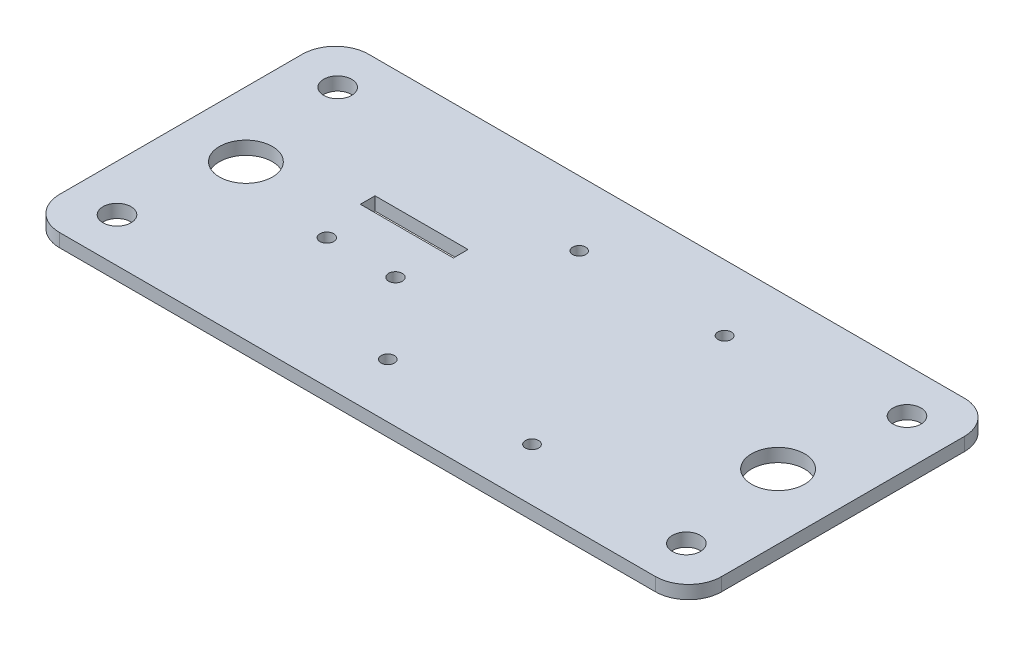
ISO-10303-21;
HEADER;
FILE_DESCRIPTION(('STEP AP214'),'2;1');
FILE_NAME('part.step','',(''),(''),'','','');
FILE_SCHEMA(('AUTOMOTIVE_DESIGN { 1 0 10303 214 1 1 1 1 }'));
ENDSEC;
DATA;
#1=APPLICATION_CONTEXT('core data for automotive mechanical design processes');
#2=APPLICATION_PROTOCOL_DEFINITION('international standard','automotive_design',2000,#1);
#3=PRODUCT_CONTEXT('',#1,'mechanical');
#4=PRODUCT('Part','Part','',(#3));
#5=PRODUCT_RELATED_PRODUCT_CATEGORY('part','',(#4));
#6=PRODUCT_DEFINITION_FORMATION('','',#4);
#7=PRODUCT_DEFINITION_CONTEXT('part definition',#1,'design');
#8=PRODUCT_DEFINITION('design','',#6,#7);
#9=PRODUCT_DEFINITION_SHAPE('','',#8);
#10=(LENGTH_UNIT() NAMED_UNIT(*) SI_UNIT(.MILLI.,.METRE.));
#11=(NAMED_UNIT(*) PLANE_ANGLE_UNIT() SI_UNIT($,.RADIAN.));
#12=(NAMED_UNIT(*) SI_UNIT($,.STERADIAN.) SOLID_ANGLE_UNIT());
#13=UNCERTAINTY_MEASURE_WITH_UNIT(LENGTH_MEASURE(1.E-05),#10,'distance_accuracy_value','');
#14=(GEOMETRIC_REPRESENTATION_CONTEXT(3) GLOBAL_UNCERTAINTY_ASSIGNED_CONTEXT((#13)) GLOBAL_UNIT_ASSIGNED_CONTEXT((#10,
#11,#12)) REPRESENTATION_CONTEXT('',''));
#15=CARTESIAN_POINT('',(0.,0.,0.));
#16=DIRECTION('',(0.,0.,1.));
#17=DIRECTION('',(1.,0.,0.));
#18=AXIS2_PLACEMENT_3D('',#15,#16,#17);
#19=CARTESIAN_POINT('',(0.,3.,0.));
#20=DIRECTION('',(0.,-1.,0.));
#21=DIRECTION('',(0.,0.,-1.));
#22=AXIS2_PLACEMENT_3D('',#19,#20,#21);
#23=PLANE('',#22);
#24=CARTESIAN_POINT('',(135.29252298,3.,-35.));
#25=DIRECTION('',(0.,1.,0.));
#26=DIRECTION('',(0.,0.,1.));
#27=AXIS2_PLACEMENT_3D('',#24,#25,#26);
#28=CIRCLE('',#27,6.00000000000002);
#29=CARTESIAN_POINT('',(135.29252298,3.,-29.));
#30=VERTEX_POINT('',#29);
#31=EDGE_CURVE('E234',#30,#30,#28,.T.);
#32=ORIENTED_EDGE('',*,*,#31,.F.);
#33=EDGE_LOOP('',(#32));
#34=FACE_BOUND('',#33,.T.);
#35=CARTESIAN_POINT('',(14.7074770151367,3.,-35.));
#36=DIRECTION('',(0.,1.,0.));
#37=DIRECTION('',(0.,0.,1.));
#38=AXIS2_PLACEMENT_3D('',#35,#36,#37);
#39=CIRCLE('',#38,6.);
#40=CARTESIAN_POINT('',(14.7074770151367,3.,-29.));
#41=VERTEX_POINT('',#40);
#42=EDGE_CURVE('E223',#41,#41,#39,.T.);
#43=ORIENTED_EDGE('',*,*,#42,.F.);
#44=EDGE_LOOP('',(#43));
#45=FACE_BOUND('',#44,.T.);
#46=CARTESIAN_POINT('',(139.500000000001,3.,-10.));
#47=DIRECTION('',(0.,1.,0.));
#48=DIRECTION('',(0.,0.,1.));
#49=AXIS2_PLACEMENT_3D('',#46,#47,#48);
#50=CIRCLE('',#49,3.175);
#51=CARTESIAN_POINT('',(139.500000000001,3.,-6.825));
#52=VERTEX_POINT('',#51);
#53=EDGE_CURVE('E222',#52,#52,#50,.T.);
#54=ORIENTED_EDGE('',*,*,#53,.F.);
#55=EDGE_LOOP('',(#54));
#56=FACE_BOUND('',#55,.T.);
#57=CARTESIAN_POINT('',(139.5,3.,-60.));
#58=DIRECTION('',(0.,1.,0.));
#59=DIRECTION('',(0.,0.,1.));
#60=AXIS2_PLACEMENT_3D('',#57,#58,#59);
#61=CIRCLE('',#60,3.175);
#62=CARTESIAN_POINT('',(139.5,3.,-56.825));
#63=VERTEX_POINT('',#62);
#64=EDGE_CURVE('E238',#63,#63,#61,.T.);
#65=ORIENTED_EDGE('',*,*,#64,.F.);
#66=EDGE_LOOP('',(#65));
#67=FACE_BOUND('',#66,.T.);
#68=CARTESIAN_POINT('',(10.5000000000007,3.,-10.));
#69=DIRECTION('',(0.,1.,0.));
#70=DIRECTION('',(0.,0.,1.));
#71=AXIS2_PLACEMENT_3D('',#68,#69,#70);
#72=CIRCLE('',#71,3.175);
#73=CARTESIAN_POINT('',(10.5000000000007,3.,-6.825));
#74=VERTEX_POINT('',#73);
#75=EDGE_CURVE('E243',#74,#74,#72,.T.);
#76=ORIENTED_EDGE('',*,*,#75,.F.);
#77=EDGE_LOOP('',(#76));
#78=FACE_BOUND('',#77,.T.);
#79=CARTESIAN_POINT('',(10.5,3.,-60.));
#80=DIRECTION('',(0.,1.,0.));
#81=DIRECTION('',(0.,0.,1.));
#82=AXIS2_PLACEMENT_3D('',#79,#80,#81);
#83=CIRCLE('',#82,3.175);
#84=CARTESIAN_POINT('',(10.5,3.,-56.825));
#85=VERTEX_POINT('',#84);
#86=EDGE_CURVE('E249',#85,#85,#83,.T.);
#87=ORIENTED_EDGE('',*,*,#86,.F.);
#88=EDGE_LOOP('',(#87));
#89=FACE_BOUND('',#88,.T.);
#90=DIRECTION('',(0.,0.,1.));
#91=VECTOR('',#90,1.);
#92=CARTESIAN_POINT('',(0.,3.,0.));
#93=LINE('',#92,#91);
#94=CARTESIAN_POINT('',(0.,3.,-62.5));
#95=VERTEX_POINT('',#94);
#96=CARTESIAN_POINT('',(0.,3.,-7.5));
#97=VERTEX_POINT('',#96);
#98=EDGE_CURVE('E170',#95,#97,#93,.T.);
#99=ORIENTED_EDGE('',*,*,#98,.T.);
#100=CARTESIAN_POINT('',(7.5,3.,-7.5));
#101=DIRECTION('',(0.,-1.,0.));
#102=DIRECTION('',(0.,0.,-1.));
#103=AXIS2_PLACEMENT_3D('',#100,#101,#102);
#104=CIRCLE('',#103,7.5);
#105=CARTESIAN_POINT('',(7.5,3.,0.));
#106=VERTEX_POINT('',#105);
#107=EDGE_CURVE('E213',#97,#106,#104,.F.);
#108=ORIENTED_EDGE('',*,*,#107,.T.);
#109=DIRECTION('',(1.,0.,0.));
#110=VECTOR('',#109,1.);
#111=CARTESIAN_POINT('',(0.,3.,0.));
#112=LINE('',#111,#110);
#113=CARTESIAN_POINT('',(142.5,3.,0.));
#114=VERTEX_POINT('',#113);
#115=EDGE_CURVE('E173',#106,#114,#112,.T.);
#116=ORIENTED_EDGE('',*,*,#115,.T.);
#117=CARTESIAN_POINT('',(142.5,3.,-7.5));
#118=DIRECTION('',(0.,-1.,0.));
#119=DIRECTION('',(0.,0.,-1.));
#120=AXIS2_PLACEMENT_3D('',#117,#118,#119);
#121=CIRCLE('',#120,7.5);
#122=CARTESIAN_POINT('',(150.,3.,-7.5));
#123=VERTEX_POINT('',#122);
#124=EDGE_CURVE('E211',#114,#123,#121,.F.);
#125=ORIENTED_EDGE('',*,*,#124,.T.);
#126=DIRECTION('',(0.,0.,-1.));
#127=VECTOR('',#126,1.);
#128=CARTESIAN_POINT('',(150.,3.,0.));
#129=LINE('',#128,#127);
#130=CARTESIAN_POINT('',(150.,3.,-62.5));
#131=VERTEX_POINT('',#130);
#132=EDGE_CURVE('E177',#123,#131,#129,.T.);
#133=ORIENTED_EDGE('',*,*,#132,.T.);
#134=CARTESIAN_POINT('',(142.5,3.,-62.5));
#135=DIRECTION('',(0.,-1.,0.));
#136=DIRECTION('',(0.,0.,-1.));
#137=AXIS2_PLACEMENT_3D('',#134,#135,#136);
#138=CIRCLE('',#137,7.5);
#139=CARTESIAN_POINT('',(142.5,3.,-70.));
#140=VERTEX_POINT('',#139);
#141=EDGE_CURVE('E56',#131,#140,#138,.F.);
#142=ORIENTED_EDGE('',*,*,#141,.T.);
#143=DIRECTION('',(-1.,0.,0.));
#144=VECTOR('',#143,1.);
#145=CARTESIAN_POINT('',(0.,3.,-70.));
#146=LINE('',#145,#144);
#147=CARTESIAN_POINT('',(7.5,3.,-70.));
#148=VERTEX_POINT('',#147);
#149=EDGE_CURVE('E179',#140,#148,#146,.T.);
#150=ORIENTED_EDGE('',*,*,#149,.T.);
#151=CARTESIAN_POINT('',(7.5,3.,-62.5));
#152=DIRECTION('',(0.,-1.,0.));
#153=DIRECTION('',(0.,0.,-1.));
#154=AXIS2_PLACEMENT_3D('',#151,#152,#153);
#155=CIRCLE('',#154,7.5);
#156=EDGE_CURVE('E208',#148,#95,#155,.F.);
#157=ORIENTED_EDGE('',*,*,#156,.T.);
#158=EDGE_LOOP('',(#99,#108,#116,#125,#133,#142,#150,#157));
#159=FACE_BOUND('',#158,.T.);
#160=DIRECTION('',(0.,0.,1.));
#161=VECTOR('',#160,1.);
#162=CARTESIAN_POINT('',(36.0212361955455,3.,-42.94231273547));
#163=LINE('',#162,#161);
#164=CARTESIAN_POINT('',(36.0212361955455,3.,-42.94231273547));
#165=VERTEX_POINT('',#164);
#166=CARTESIAN_POINT('',(36.0212361955455,3.,-39.6212864919269));
#167=VERTEX_POINT('',#166);
#168=EDGE_CURVE('E126',#165,#167,#163,.T.);
#169=ORIENTED_EDGE('',*,*,#168,.F.);
#170=DIRECTION('',(-1.,0.,0.));
#171=VECTOR('',#170,1.);
#172=CARTESIAN_POINT('',(36.0212361955455,3.,-42.94231273547));
#173=LINE('',#172,#171);
#174=CARTESIAN_POINT('',(57.097585157728,3.,-42.94231273547));
#175=VERTEX_POINT('',#174);
#176=EDGE_CURVE('E152',#175,#165,#173,.T.);
#177=ORIENTED_EDGE('',*,*,#176,.F.);
#178=DIRECTION('',(0.,0.,-1.));
#179=VECTOR('',#178,1.);
#180=CARTESIAN_POINT('',(57.097585157728,3.,-42.94231273547));
#181=LINE('',#180,#179);
#182=CARTESIAN_POINT('',(57.097585157728,3.,-39.6212864919269));
#183=VERTEX_POINT('',#182);
#184=EDGE_CURVE('E150',#183,#175,#181,.T.);
#185=ORIENTED_EDGE('',*,*,#184,.F.);
#186=DIRECTION('',(1.,0.,0.));
#187=VECTOR('',#186,1.);
#188=CARTESIAN_POINT('',(36.0212361955455,3.,-39.6212864919269));
#189=LINE('',#188,#187);
#190=EDGE_CURVE('E136',#167,#183,#189,.T.);
#191=ORIENTED_EDGE('',*,*,#190,.F.);
#192=EDGE_LOOP('',(#169,#177,#185,#191));
#193=FACE_BOUND('',#192,.T.);
#194=CARTESIAN_POINT('',(103.082572264509,3.,-55.0825506042326));
#195=DIRECTION('',(0.,1.,0.));
#196=DIRECTION('',(0.,0.,1.));
#197=AXIS2_PLACEMENT_3D('',#194,#195,#196);
#198=CIRCLE('',#197,1.50542427552396);
#199=CARTESIAN_POINT('',(103.082572264509,3.,-53.5771263287086));
#200=VERTEX_POINT('',#199);
#201=EDGE_CURVE('E159',#200,#200,#198,.T.);
#202=ORIENTED_EDGE('',*,*,#201,.F.);
#203=EDGE_LOOP('',(#202));
#204=FACE_BOUND('',#203,.T.);
#205=CARTESIAN_POINT('',(69.5599243298686,3.,-12.3002252487621));
#206=DIRECTION('',(0.,1.,0.));
#207=DIRECTION('',(0.,0.,1.));
#208=AXIS2_PLACEMENT_3D('',#205,#206,#207);
#209=CIRCLE('',#208,1.49848088025638);
#210=CARTESIAN_POINT('',(69.5599243298686,3.,-10.8017443685057));
#211=VERTEX_POINT('',#210);
#212=EDGE_CURVE('E282',#211,#211,#209,.T.);
#213=ORIENTED_EDGE('',*,*,#212,.F.);
#214=EDGE_LOOP('',(#213));
#215=FACE_BOUND('',#214,.T.);
#216=CARTESIAN_POINT('',(69.9544019087388,3.,-55.2794120577473));
#217=DIRECTION('',(0.,1.,0.));
#218=DIRECTION('',(0.,0.,1.));
#219=AXIS2_PLACEMENT_3D('',#216,#217,#218);
#220=CIRCLE('',#219,1.47441383217736);
#221=CARTESIAN_POINT('',(69.9544019087388,3.,-53.8049982255699));
#222=VERTEX_POINT('',#221);
#223=EDGE_CURVE('E276',#222,#222,#220,.T.);
#224=ORIENTED_EDGE('',*,*,#223,.F.);
#225=EDGE_LOOP('',(#224));
#226=FACE_BOUND('',#225,.T.);
#227=CARTESIAN_POINT('',(102.570189973832,3.,-11.9686781932026));
#228=DIRECTION('',(0.,1.,0.));
#229=DIRECTION('',(0.,0.,1.));
#230=AXIS2_PLACEMENT_3D('',#227,#228,#229);
#231=CIRCLE('',#230,1.5);
#232=CARTESIAN_POINT('',(102.570189973832,3.,-10.4686781932026));
#233=VERTEX_POINT('',#232);
#234=EDGE_CURVE('E270',#233,#233,#231,.T.);
#235=ORIENTED_EDGE('',*,*,#234,.F.);
#236=EDGE_LOOP('',(#235));
#237=FACE_BOUND('',#236,.T.);
#238=CARTESIAN_POINT('',(38.765135157728,3.,-29.2683611585074));
#239=DIRECTION('',(0.,1.,0.));
#240=DIRECTION('',(0.,0.,1.));
#241=AXIS2_PLACEMENT_3D('',#238,#239,#240);
#242=CIRCLE('',#241,1.55575);
#243=CARTESIAN_POINT('',(38.765135157728,3.,-27.7126111585074));
#244=VERTEX_POINT('',#243);
#245=EDGE_CURVE('E264',#244,#244,#242,.T.);
#246=ORIENTED_EDGE('',*,*,#245,.F.);
#247=EDGE_LOOP('',(#246));
#248=FACE_BOUND('',#247,.T.);
#249=CARTESIAN_POINT('',(54.322635157728,3.,-29.2683611585074));
#250=DIRECTION('',(0.,1.,0.));
#251=DIRECTION('',(0.,0.,1.));
#252=AXIS2_PLACEMENT_3D('',#249,#250,#251);
#253=CIRCLE('',#252,1.5557500000013);
#254=CARTESIAN_POINT('',(54.322635157728,3.,-27.7126111585061));
#255=VERTEX_POINT('',#254);
#256=EDGE_CURVE('E258',#255,#255,#253,.T.);
#257=ORIENTED_EDGE('',*,*,#256,.F.);
#258=EDGE_LOOP('',(#257));
#259=FACE_BOUND('',#258,.T.);
#260=ADVANCED_FACE('F33',(#34,#45,#56,#67,#78,#89,#159,#193,#204,#215,#226,#237,#248,#259),#23,.F.);
#261=CARTESIAN_POINT('',(0.,0.,0.));
#262=DIRECTION('',(0.,-1.,0.));
#263=DIRECTION('',(0.,0.,-1.));
#264=AXIS2_PLACEMENT_3D('',#261,#262,#263);
#265=PLANE('',#264);
#266=CARTESIAN_POINT('',(135.29252298,0.,-35.));
#267=DIRECTION('',(0.,-1.,0.));
#268=DIRECTION('',(0.,0.,-1.));
#269=AXIS2_PLACEMENT_3D('',#266,#267,#268);
#270=CIRCLE('',#269,6.00000000000002);
#271=CARTESIAN_POINT('',(135.29252298,0.,-41.));
#272=VERTEX_POINT('',#271);
#273=EDGE_CURVE('E37',#272,#272,#270,.T.);
#274=ORIENTED_EDGE('',*,*,#273,.F.);
#275=EDGE_LOOP('',(#274));
#276=FACE_BOUND('',#275,.T.);
#277=CARTESIAN_POINT('',(14.7074770151367,0.,-35.));
#278=DIRECTION('',(0.,-1.,0.));
#279=DIRECTION('',(0.,0.,-1.));
#280=AXIS2_PLACEMENT_3D('',#277,#278,#279);
#281=CIRCLE('',#280,6.);
#282=CARTESIAN_POINT('',(14.7074770151367,0.,-41.));
#283=VERTEX_POINT('',#282);
#284=EDGE_CURVE('E220',#283,#283,#281,.T.);
#285=ORIENTED_EDGE('',*,*,#284,.F.);
#286=EDGE_LOOP('',(#285));
#287=FACE_BOUND('',#286,.T.);
#288=CARTESIAN_POINT('',(139.500000000001,0.,-10.));
#289=DIRECTION('',(0.,1.,0.));
#290=DIRECTION('',(0.,0.,1.));
#291=AXIS2_PLACEMENT_3D('',#288,#289,#290);
#292=CIRCLE('',#291,3.175);
#293=CARTESIAN_POINT('',(139.500000000001,0.,-6.825));
#294=VERTEX_POINT('',#293);
#295=EDGE_CURVE('E227',#294,#294,#292,.T.);
#296=ORIENTED_EDGE('',*,*,#295,.T.);
#297=EDGE_LOOP('',(#296));
#298=FACE_BOUND('',#297,.T.);
#299=CARTESIAN_POINT('',(139.5,0.,-60.));
#300=DIRECTION('',(0.,1.,0.));
#301=DIRECTION('',(0.,0.,1.));
#302=AXIS2_PLACEMENT_3D('',#299,#300,#301);
#303=CIRCLE('',#302,3.175);
#304=CARTESIAN_POINT('',(139.5,0.,-56.825));
#305=VERTEX_POINT('',#304);
#306=EDGE_CURVE('E240',#305,#305,#303,.T.);
#307=ORIENTED_EDGE('',*,*,#306,.T.);
#308=EDGE_LOOP('',(#307));
#309=FACE_BOUND('',#308,.T.);
#310=CARTESIAN_POINT('',(10.5000000000007,0.,-10.));
#311=DIRECTION('',(0.,1.,0.));
#312=DIRECTION('',(0.,0.,1.));
#313=AXIS2_PLACEMENT_3D('',#310,#311,#312);
#314=CIRCLE('',#313,3.175);
#315=CARTESIAN_POINT('',(10.5000000000007,0.,-6.825));
#316=VERTEX_POINT('',#315);
#317=EDGE_CURVE('E246',#316,#316,#314,.T.);
#318=ORIENTED_EDGE('',*,*,#317,.T.);
#319=EDGE_LOOP('',(#318));
#320=FACE_BOUND('',#319,.T.);
#321=CARTESIAN_POINT('',(10.5,0.,-60.));
#322=DIRECTION('',(0.,1.,0.));
#323=DIRECTION('',(0.,0.,1.));
#324=AXIS2_PLACEMENT_3D('',#321,#322,#323);
#325=CIRCLE('',#324,3.175);
#326=CARTESIAN_POINT('',(10.5,0.,-56.825));
#327=VERTEX_POINT('',#326);
#328=EDGE_CURVE('E252',#327,#327,#325,.T.);
#329=ORIENTED_EDGE('',*,*,#328,.T.);
#330=EDGE_LOOP('',(#329));
#331=FACE_BOUND('',#330,.T.);
#332=CARTESIAN_POINT('',(38.765135157728,0.,-29.2683611585074));
#333=DIRECTION('',(0.,1.,0.));
#334=DIRECTION('',(0.,0.,1.));
#335=AXIS2_PLACEMENT_3D('',#332,#333,#334);
#336=CIRCLE('',#335,1.55575);
#337=CARTESIAN_POINT('',(38.765135157728,0.,-27.7126111585074));
#338=VERTEX_POINT('',#337);
#339=EDGE_CURVE('E261',#338,#338,#336,.T.);
#340=ORIENTED_EDGE('',*,*,#339,.T.);
#341=EDGE_LOOP('',(#340));
#342=FACE_BOUND('',#341,.T.);
#343=CARTESIAN_POINT('',(69.9544019087388,0.,-55.2794120577473));
#344=DIRECTION('',(0.,1.,0.));
#345=DIRECTION('',(0.,0.,1.));
#346=AXIS2_PLACEMENT_3D('',#343,#344,#345);
#347=CIRCLE('',#346,1.47441383217736);
#348=CARTESIAN_POINT('',(69.9544019087388,0.,-53.8049982255699));
#349=VERTEX_POINT('',#348);
#350=EDGE_CURVE('E273',#349,#349,#347,.T.);
#351=ORIENTED_EDGE('',*,*,#350,.T.);
#352=EDGE_LOOP('',(#351));
#353=FACE_BOUND('',#352,.T.);
#354=CARTESIAN_POINT('',(103.082572264509,0.,-55.0825506042326));
#355=DIRECTION('',(0.,1.,0.));
#356=DIRECTION('',(0.,0.,1.));
#357=AXIS2_PLACEMENT_3D('',#354,#355,#356);
#358=CIRCLE('',#357,1.50542427552396);
#359=CARTESIAN_POINT('',(103.082572264509,0.,-53.5771263287086));
#360=VERTEX_POINT('',#359);
#361=EDGE_CURVE('E285',#360,#360,#358,.T.);
#362=ORIENTED_EDGE('',*,*,#361,.T.);
#363=EDGE_LOOP('',(#362));
#364=FACE_BOUND('',#363,.T.);
#365=DIRECTION('',(1.,0.,0.));
#366=VECTOR('',#365,1.);
#367=CARTESIAN_POINT('',(0.,0.,0.));
#368=LINE('',#367,#366);
#369=CARTESIAN_POINT('',(7.5,0.,0.));
#370=VERTEX_POINT('',#369);
#371=CARTESIAN_POINT('',(142.5,0.,0.));
#372=VERTEX_POINT('',#371);
#373=EDGE_CURVE('E184',#370,#372,#368,.T.);
#374=ORIENTED_EDGE('',*,*,#373,.F.);
#375=CARTESIAN_POINT('',(7.5,0.,-7.5));
#376=DIRECTION('',(0.,-1.,0.));
#377=DIRECTION('',(0.,0.,-1.));
#378=AXIS2_PLACEMENT_3D('',#375,#376,#377);
#379=CIRCLE('',#378,7.5);
#380=CARTESIAN_POINT('',(0.,0.,-7.5));
#381=VERTEX_POINT('',#380);
#382=EDGE_CURVE('E201',#370,#381,#379,.T.);
#383=ORIENTED_EDGE('',*,*,#382,.T.);
#384=DIRECTION('',(0.,0.,1.));
#385=VECTOR('',#384,1.);
#386=CARTESIAN_POINT('',(0.,0.,0.));
#387=LINE('',#386,#385);
#388=CARTESIAN_POINT('',(0.,0.,-62.5));
#389=VERTEX_POINT('',#388);
#390=EDGE_CURVE('E144',#389,#381,#387,.T.);
#391=ORIENTED_EDGE('',*,*,#390,.F.);
#392=CARTESIAN_POINT('',(7.5,0.,-62.5));
#393=DIRECTION('',(0.,-1.,0.));
#394=DIRECTION('',(0.,0.,-1.));
#395=AXIS2_PLACEMENT_3D('',#392,#393,#394);
#396=CIRCLE('',#395,7.5);
#397=CARTESIAN_POINT('',(7.5,0.,-70.));
#398=VERTEX_POINT('',#397);
#399=EDGE_CURVE('E195',#389,#398,#396,.T.);
#400=ORIENTED_EDGE('',*,*,#399,.T.);
#401=DIRECTION('',(-1.,0.,0.));
#402=VECTOR('',#401,1.);
#403=CARTESIAN_POINT('',(0.,0.,-70.));
#404=LINE('',#403,#402);
#405=CARTESIAN_POINT('',(142.5,0.,-70.));
#406=VERTEX_POINT('',#405);
#407=EDGE_CURVE('E174',#406,#398,#404,.T.);
#408=ORIENTED_EDGE('',*,*,#407,.F.);
#409=CARTESIAN_POINT('',(142.5,0.,-62.5));
#410=DIRECTION('',(0.,-1.,0.));
#411=DIRECTION('',(0.,0.,-1.));
#412=AXIS2_PLACEMENT_3D('',#409,#410,#411);
#413=CIRCLE('',#412,7.5);
#414=CARTESIAN_POINT('',(150.,0.,-62.5));
#415=VERTEX_POINT('',#414);
#416=EDGE_CURVE('E197',#406,#415,#413,.T.);
#417=ORIENTED_EDGE('',*,*,#416,.T.);
#418=DIRECTION('',(0.,0.,-1.));
#419=VECTOR('',#418,1.);
#420=CARTESIAN_POINT('',(150.,0.,0.));
#421=LINE('',#420,#419);
#422=CARTESIAN_POINT('',(150.,0.,-7.5));
#423=VERTEX_POINT('',#422);
#424=EDGE_CURVE('E187',#423,#415,#421,.T.);
#425=ORIENTED_EDGE('',*,*,#424,.F.);
#426=CARTESIAN_POINT('',(142.5,0.,-7.5));
#427=DIRECTION('',(0.,-1.,0.));
#428=DIRECTION('',(0.,0.,-1.));
#429=AXIS2_PLACEMENT_3D('',#426,#427,#428);
#430=CIRCLE('',#429,7.5);
#431=EDGE_CURVE('E199',#423,#372,#430,.T.);
#432=ORIENTED_EDGE('',*,*,#431,.T.);
#433=EDGE_LOOP('',(#374,#383,#391,#400,#408,#417,#425,#432));
#434=FACE_BOUND('',#433,.T.);
#435=DIRECTION('',(-1.,0.,0.));
#436=VECTOR('',#435,1.);
#437=CARTESIAN_POINT('',(36.0212361955455,0.,-42.94231273547));
#438=LINE('',#437,#436);
#439=CARTESIAN_POINT('',(57.097585157728,0.,-42.94231273547));
#440=VERTEX_POINT('',#439);
#441=CARTESIAN_POINT('',(36.0212361955455,0.,-42.94231273547));
#442=VERTEX_POINT('',#441);
#443=EDGE_CURVE('E137',#440,#442,#438,.T.);
#444=ORIENTED_EDGE('',*,*,#443,.T.);
#445=DIRECTION('',(0.,0.,1.));
#446=VECTOR('',#445,1.);
#447=CARTESIAN_POINT('',(36.0212361955455,0.,-42.94231273547));
#448=LINE('',#447,#446);
#449=CARTESIAN_POINT('',(36.0212361955455,0.,-39.6212864919269));
#450=VERTEX_POINT('',#449);
#451=EDGE_CURVE('E157',#442,#450,#448,.T.);
#452=ORIENTED_EDGE('',*,*,#451,.T.);
#453=DIRECTION('',(1.,0.,0.));
#454=VECTOR('',#453,1.);
#455=CARTESIAN_POINT('',(36.0212361955455,0.,-39.6212864919269));
#456=LINE('',#455,#454);
#457=CARTESIAN_POINT('',(57.097585157728,0.,-39.6212864919269));
#458=VERTEX_POINT('',#457);
#459=EDGE_CURVE('E143',#450,#458,#456,.T.);
#460=ORIENTED_EDGE('',*,*,#459,.T.);
#461=DIRECTION('',(0.,0.,-1.));
#462=VECTOR('',#461,1.);
#463=CARTESIAN_POINT('',(57.097585157728,0.,-42.94231273547));
#464=LINE('',#463,#462);
#465=EDGE_CURVE('E161',#458,#440,#464,.T.);
#466=ORIENTED_EDGE('',*,*,#465,.T.);
#467=EDGE_LOOP('',(#444,#452,#460,#466));
#468=FACE_BOUND('',#467,.T.);
#469=CARTESIAN_POINT('',(69.5599243298686,0.,-12.3002252487621));
#470=DIRECTION('',(0.,1.,0.));
#471=DIRECTION('',(0.,0.,1.));
#472=AXIS2_PLACEMENT_3D('',#469,#470,#471);
#473=CIRCLE('',#472,1.49848088025638);
#474=CARTESIAN_POINT('',(69.5599243298686,0.,-10.8017443685057));
#475=VERTEX_POINT('',#474);
#476=EDGE_CURVE('E279',#475,#475,#473,.T.);
#477=ORIENTED_EDGE('',*,*,#476,.T.);
#478=EDGE_LOOP('',(#477));
#479=FACE_BOUND('',#478,.T.);
#480=CARTESIAN_POINT('',(102.570189973832,0.,-11.9686781932026));
#481=DIRECTION('',(0.,1.,0.));
#482=DIRECTION('',(0.,0.,1.));
#483=AXIS2_PLACEMENT_3D('',#480,#481,#482);
#484=CIRCLE('',#483,1.5);
#485=CARTESIAN_POINT('',(102.570189973832,0.,-10.4686781932026));
#486=VERTEX_POINT('',#485);
#487=EDGE_CURVE('E267',#486,#486,#484,.T.);
#488=ORIENTED_EDGE('',*,*,#487,.T.);
#489=EDGE_LOOP('',(#488));
#490=FACE_BOUND('',#489,.T.);
#491=CARTESIAN_POINT('',(54.322635157728,0.,-29.2683611585074));
#492=DIRECTION('',(0.,1.,0.));
#493=DIRECTION('',(0.,0.,1.));
#494=AXIS2_PLACEMENT_3D('',#491,#492,#493);
#495=CIRCLE('',#494,1.5557500000013);
#496=CARTESIAN_POINT('',(54.322635157728,0.,-27.7126111585061));
#497=VERTEX_POINT('',#496);
#498=EDGE_CURVE('E255',#497,#497,#495,.T.);
#499=ORIENTED_EDGE('',*,*,#498,.T.);
#500=EDGE_LOOP('',(#499));
#501=FACE_BOUND('',#500,.T.);
#502=ADVANCED_FACE('F292',(#276,#287,#298,#309,#320,#331,#342,#353,#364,#434,#468,#479,#490,
#501),#265,.T.);
#503=CARTESIAN_POINT('',(0.,3.,0.));
#504=DIRECTION('',(1.,0.,0.));
#505=DIRECTION('',(0.,0.,-1.));
#506=AXIS2_PLACEMENT_3D('',#503,#504,#505);
#507=PLANE('',#506);
#508=ORIENTED_EDGE('',*,*,#390,.T.);
#509=DIRECTION('',(0.,-1.,0.));
#510=VECTOR('',#509,1.);
#511=CARTESIAN_POINT('',(0.,3.,-7.5));
#512=LINE('',#511,#510);
#513=EDGE_CURVE('E206',#381,#97,#512,.F.);
#514=ORIENTED_EDGE('',*,*,#513,.T.);
#515=ORIENTED_EDGE('',*,*,#98,.F.);
#516=DIRECTION('',(0.,-1.,0.));
#517=VECTOR('',#516,1.);
#518=CARTESIAN_POINT('',(0.,3.,-62.5));
#519=LINE('',#518,#517);
#520=EDGE_CURVE('E203',#95,#389,#519,.T.);
#521=ORIENTED_EDGE('',*,*,#520,.T.);
#522=EDGE_LOOP('',(#508,#514,#515,#521));
#523=FACE_BOUND('',#522,.T.);
#524=ADVANCED_FACE('F317',(#523),#507,.F.);
#525=CARTESIAN_POINT('',(0.,3.,0.));
#526=DIRECTION('',(0.,0.,-1.));
#527=DIRECTION('',(-1.,0.,0.));
#528=AXIS2_PLACEMENT_3D('',#525,#526,#527);
#529=PLANE('',#528);
#530=ORIENTED_EDGE('',*,*,#115,.F.);
#531=DIRECTION('',(0.,-1.,0.));
#532=VECTOR('',#531,1.);
#533=CARTESIAN_POINT('',(7.5,3.,0.));
#534=LINE('',#533,#532);
#535=EDGE_CURVE('E192',#106,#370,#534,.T.);
#536=ORIENTED_EDGE('',*,*,#535,.T.);
#537=ORIENTED_EDGE('',*,*,#373,.T.);
#538=DIRECTION('',(0.,-1.,0.));
#539=VECTOR('',#538,1.);
#540=CARTESIAN_POINT('',(142.5,3.,0.));
#541=LINE('',#540,#539);
#542=EDGE_CURVE('E181',#372,#114,#541,.F.);
#543=ORIENTED_EDGE('',*,*,#542,.T.);
#544=EDGE_LOOP('',(#530,#536,#537,#543));
#545=FACE_BOUND('',#544,.T.);
#546=ADVANCED_FACE('F331',(#545),#529,.F.);
#547=CARTESIAN_POINT('',(150.,3.,0.));
#548=DIRECTION('',(-1.,0.,0.));
#549=DIRECTION('',(0.,0.,1.));
#550=AXIS2_PLACEMENT_3D('',#547,#548,#549);
#551=PLANE('',#550);
#552=ORIENTED_EDGE('',*,*,#132,.F.);
#553=DIRECTION('',(0.,-1.,0.));
#554=VECTOR('',#553,1.);
#555=CARTESIAN_POINT('',(150.,3.,-7.5));
#556=LINE('',#555,#554);
#557=EDGE_CURVE('E217',#123,#423,#556,.T.);
#558=ORIENTED_EDGE('',*,*,#557,.T.);
#559=ORIENTED_EDGE('',*,*,#424,.T.);
#560=DIRECTION('',(0.,-1.,0.));
#561=VECTOR('',#560,1.);
#562=CARTESIAN_POINT('',(150.,3.,-62.5));
#563=LINE('',#562,#561);
#564=EDGE_CURVE('E215',#415,#131,#563,.F.);
#565=ORIENTED_EDGE('',*,*,#564,.T.);
#566=EDGE_LOOP('',(#552,#558,#559,#565));
#567=FACE_BOUND('',#566,.T.);
#568=ADVANCED_FACE('F328',(#567),#551,.F.);
#569=CARTESIAN_POINT('',(0.,3.,-70.));
#570=DIRECTION('',(0.,0.,1.));
#571=DIRECTION('',(1.,0.,0.));
#572=AXIS2_PLACEMENT_3D('',#569,#570,#571);
#573=PLANE('',#572);
#574=ORIENTED_EDGE('',*,*,#149,.F.);
#575=DIRECTION('',(0.,-1.,0.));
#576=VECTOR('',#575,1.);
#577=CARTESIAN_POINT('',(142.5,3.,-70.));
#578=LINE('',#577,#576);
#579=EDGE_CURVE('E11',#140,#406,#578,.T.);
#580=ORIENTED_EDGE('',*,*,#579,.T.);
#581=ORIENTED_EDGE('',*,*,#407,.T.);
#582=DIRECTION('',(0.,-1.,0.));
#583=VECTOR('',#582,1.);
#584=CARTESIAN_POINT('',(7.5,3.,-70.));
#585=LINE('',#584,#583);
#586=EDGE_CURVE('E42',#398,#148,#585,.F.);
#587=ORIENTED_EDGE('',*,*,#586,.T.);
#588=EDGE_LOOP('',(#574,#580,#581,#587));
#589=FACE_BOUND('',#588,.T.);
#590=ADVANCED_FACE('F325',(#589),#573,.F.);
#591=CARTESIAN_POINT('',(36.0212361955455,3.,-42.94231273547));
#592=DIRECTION('',(1.,0.,0.));
#593=DIRECTION('',(0.,0.,-1.));
#594=AXIS2_PLACEMENT_3D('',#591,#592,#593);
#595=PLANE('',#594);
#596=ORIENTED_EDGE('',*,*,#451,.F.);
#597=DIRECTION('',(0.,-1.,0.));
#598=VECTOR('',#597,1.);
#599=CARTESIAN_POINT('',(36.0212361955455,3.,-42.94231273547));
#600=LINE('',#599,#598);
#601=EDGE_CURVE('E132',#165,#442,#600,.T.);
#602=ORIENTED_EDGE('',*,*,#601,.F.);
#603=ORIENTED_EDGE('',*,*,#168,.T.);
#604=DIRECTION('',(0.,-1.,0.));
#605=VECTOR('',#604,1.);
#606=CARTESIAN_POINT('',(36.0212361955455,3.,-39.6212864919269));
#607=LINE('',#606,#605);
#608=EDGE_CURVE('E129',#167,#450,#607,.T.);
#609=ORIENTED_EDGE('',*,*,#608,.T.);
#610=EDGE_LOOP('',(#596,#602,#603,#609));
#611=FACE_BOUND('',#610,.T.);
#612=ADVANCED_FACE('F128',(#611),#595,.T.);
#613=CARTESIAN_POINT('',(36.0212361955455,3.,-39.6212864919269));
#614=DIRECTION('',(0.,0.,-1.));
#615=DIRECTION('',(-1.,0.,0.));
#616=AXIS2_PLACEMENT_3D('',#613,#614,#615);
#617=PLANE('',#616);
#618=ORIENTED_EDGE('',*,*,#459,.F.);
#619=ORIENTED_EDGE('',*,*,#608,.F.);
#620=ORIENTED_EDGE('',*,*,#190,.T.);
#621=DIRECTION('',(0.,-1.,0.));
#622=VECTOR('',#621,1.);
#623=CARTESIAN_POINT('',(57.097585157728,3.,-39.6212864919269));
#624=LINE('',#623,#622);
#625=EDGE_CURVE('E145',#183,#458,#624,.T.);
#626=ORIENTED_EDGE('',*,*,#625,.T.);
#627=EDGE_LOOP('',(#618,#619,#620,#626));
#628=FACE_BOUND('',#627,.T.);
#629=ADVANCED_FACE('F140',(#628),#617,.T.);
#630=CARTESIAN_POINT('',(57.097585157728,3.,-42.94231273547));
#631=DIRECTION('',(-1.,0.,0.));
#632=DIRECTION('',(0.,0.,1.));
#633=AXIS2_PLACEMENT_3D('',#630,#631,#632);
#634=PLANE('',#633);
#635=ORIENTED_EDGE('',*,*,#465,.F.);
#636=ORIENTED_EDGE('',*,*,#625,.F.);
#637=ORIENTED_EDGE('',*,*,#184,.T.);
#638=DIRECTION('',(0.,-1.,0.));
#639=VECTOR('',#638,1.);
#640=CARTESIAN_POINT('',(57.097585157728,3.,-42.94231273547));
#641=LINE('',#640,#639);
#642=EDGE_CURVE('E167',#175,#440,#641,.T.);
#643=ORIENTED_EDGE('',*,*,#642,.T.);
#644=EDGE_LOOP('',(#635,#636,#637,#643));
#645=FACE_BOUND('',#644,.T.);
#646=ADVANCED_FACE('F308',(#645),#634,.T.);
#647=CARTESIAN_POINT('',(36.0212361955455,3.,-42.94231273547));
#648=DIRECTION('',(0.,0.,1.));
#649=DIRECTION('',(1.,0.,0.));
#650=AXIS2_PLACEMENT_3D('',#647,#648,#649);
#651=PLANE('',#650);
#652=ORIENTED_EDGE('',*,*,#443,.F.);
#653=ORIENTED_EDGE('',*,*,#642,.F.);
#654=ORIENTED_EDGE('',*,*,#176,.T.);
#655=ORIENTED_EDGE('',*,*,#601,.T.);
#656=EDGE_LOOP('',(#652,#653,#654,#655));
#657=FACE_BOUND('',#656,.T.);
#658=ADVANCED_FACE('F298',(#657),#651,.T.);
#659=CARTESIAN_POINT('',(103.082572264509,3.,-55.0825506042326));
#660=DIRECTION('',(0.,-1.,0.));
#661=DIRECTION('',(0.,0.,-1.));
#662=AXIS2_PLACEMENT_3D('',#659,#660,#661);
#663=CYLINDRICAL_SURFACE('',#662,1.50542427552396);
#664=ORIENTED_EDGE('',*,*,#201,.T.);
#665=EDGE_LOOP('',(#664));
#666=FACE_BOUND('',#665,.T.);
#667=ORIENTED_EDGE('',*,*,#361,.F.);
#668=EDGE_LOOP('',(#667));
#669=FACE_BOUND('',#668,.T.);
#670=ADVANCED_FACE('F295',(#666,#669),#663,.F.);
#671=CARTESIAN_POINT('',(69.5599243298686,3.,-12.3002252487621));
#672=DIRECTION('',(0.,-1.,0.));
#673=DIRECTION('',(0.,0.,-1.));
#674=AXIS2_PLACEMENT_3D('',#671,#672,#673);
#675=CYLINDRICAL_SURFACE('',#674,1.49848088025638);
#676=ORIENTED_EDGE('',*,*,#212,.T.);
#677=EDGE_LOOP('',(#676));
#678=FACE_BOUND('',#677,.T.);
#679=ORIENTED_EDGE('',*,*,#476,.F.);
#680=EDGE_LOOP('',(#679));
#681=FACE_BOUND('',#680,.T.);
#682=ADVANCED_FACE('F297',(#678,#681),#675,.F.);
#683=CARTESIAN_POINT('',(69.9544019087388,3.,-55.2794120577473));
#684=DIRECTION('',(0.,-1.,0.));
#685=DIRECTION('',(0.,0.,-1.));
#686=AXIS2_PLACEMENT_3D('',#683,#684,#685);
#687=CYLINDRICAL_SURFACE('',#686,1.47441383217736);
#688=ORIENTED_EDGE('',*,*,#223,.T.);
#689=EDGE_LOOP('',(#688));
#690=FACE_BOUND('',#689,.T.);
#691=ORIENTED_EDGE('',*,*,#350,.F.);
#692=EDGE_LOOP('',(#691));
#693=FACE_BOUND('',#692,.T.);
#694=ADVANCED_FACE('F305',(#690,#693),#687,.F.);
#695=CARTESIAN_POINT('',(102.570189973832,3.,-11.9686781932026));
#696=DIRECTION('',(0.,-1.,0.));
#697=DIRECTION('',(0.,0.,-1.));
#698=AXIS2_PLACEMENT_3D('',#695,#696,#697);
#699=CYLINDRICAL_SURFACE('',#698,1.5);
#700=ORIENTED_EDGE('',*,*,#234,.T.);
#701=EDGE_LOOP('',(#700));
#702=FACE_BOUND('',#701,.T.);
#703=ORIENTED_EDGE('',*,*,#487,.F.);
#704=EDGE_LOOP('',(#703));
#705=FACE_BOUND('',#704,.T.);
#706=ADVANCED_FACE('F394',(#702,#705),#699,.F.);
#707=CARTESIAN_POINT('',(38.765135157728,3.,-29.2683611585074));
#708=DIRECTION('',(0.,-1.,0.));
#709=DIRECTION('',(0.,0.,-1.));
#710=AXIS2_PLACEMENT_3D('',#707,#708,#709);
#711=CYLINDRICAL_SURFACE('',#710,1.55575);
#712=ORIENTED_EDGE('',*,*,#245,.T.);
#713=EDGE_LOOP('',(#712));
#714=FACE_BOUND('',#713,.T.);
#715=ORIENTED_EDGE('',*,*,#339,.F.);
#716=EDGE_LOOP('',(#715));
#717=FACE_BOUND('',#716,.T.);
#718=ADVANCED_FACE('F384',(#714,#717),#711,.F.);
#719=CARTESIAN_POINT('',(54.322635157728,3.,-29.2683611585074));
#720=DIRECTION('',(0.,-1.,0.));
#721=DIRECTION('',(0.,0.,-1.));
#722=AXIS2_PLACEMENT_3D('',#719,#720,#721);
#723=CYLINDRICAL_SURFACE('',#722,1.5557500000013);
#724=ORIENTED_EDGE('',*,*,#256,.T.);
#725=EDGE_LOOP('',(#724));
#726=FACE_BOUND('',#725,.T.);
#727=ORIENTED_EDGE('',*,*,#498,.F.);
#728=EDGE_LOOP('',(#727));
#729=FACE_BOUND('',#728,.T.);
#730=ADVANCED_FACE('F381',(#726,#729),#723,.F.);
#731=CARTESIAN_POINT('',(10.5,0.,-60.));
#732=DIRECTION('',(0.,1.,0.));
#733=DIRECTION('',(0.,0.,1.));
#734=AXIS2_PLACEMENT_3D('',#731,#732,#733);
#735=CYLINDRICAL_SURFACE('',#734,3.175);
#736=ORIENTED_EDGE('',*,*,#328,.F.);
#737=EDGE_LOOP('',(#736));
#738=FACE_BOUND('',#737,.T.);
#739=ORIENTED_EDGE('',*,*,#86,.T.);
#740=EDGE_LOOP('',(#739));
#741=FACE_BOUND('',#740,.T.);
#742=ADVANCED_FACE('F383',(#738,#741),#735,.F.);
#743=CARTESIAN_POINT('',(10.5000000000007,0.,-10.));
#744=DIRECTION('',(0.,1.,0.));
#745=DIRECTION('',(0.,0.,1.));
#746=AXIS2_PLACEMENT_3D('',#743,#744,#745);
#747=CYLINDRICAL_SURFACE('',#746,3.175);
#748=ORIENTED_EDGE('',*,*,#317,.F.);
#749=EDGE_LOOP('',(#748));
#750=FACE_BOUND('',#749,.T.);
#751=ORIENTED_EDGE('',*,*,#75,.T.);
#752=EDGE_LOOP('',(#751));
#753=FACE_BOUND('',#752,.T.);
#754=ADVANCED_FACE('F391',(#750,#753),#747,.F.);
#755=CARTESIAN_POINT('',(139.5,0.,-60.));
#756=DIRECTION('',(0.,1.,0.));
#757=DIRECTION('',(0.,0.,1.));
#758=AXIS2_PLACEMENT_3D('',#755,#756,#757);
#759=CYLINDRICAL_SURFACE('',#758,3.175);
#760=ORIENTED_EDGE('',*,*,#306,.F.);
#761=EDGE_LOOP('',(#760));
#762=FACE_BOUND('',#761,.T.);
#763=ORIENTED_EDGE('',*,*,#64,.T.);
#764=EDGE_LOOP('',(#763));
#765=FACE_BOUND('',#764,.T.);
#766=ADVANCED_FACE('F450',(#762,#765),#759,.F.);
#767=CARTESIAN_POINT('',(139.500000000001,0.,-10.));
#768=DIRECTION('',(0.,1.,0.));
#769=DIRECTION('',(0.,0.,1.));
#770=AXIS2_PLACEMENT_3D('',#767,#768,#769);
#771=CYLINDRICAL_SURFACE('',#770,3.175);
#772=ORIENTED_EDGE('',*,*,#295,.F.);
#773=EDGE_LOOP('',(#772));
#774=FACE_BOUND('',#773,.T.);
#775=ORIENTED_EDGE('',*,*,#53,.T.);
#776=EDGE_LOOP('',(#775));
#777=FACE_BOUND('',#776,.T.);
#778=ADVANCED_FACE('F343',(#774,#777),#771,.F.);
#779=CARTESIAN_POINT('',(7.5,3.,-7.5));
#780=DIRECTION('',(0.,-1.,0.));
#781=DIRECTION('',(0.,0.,-1.));
#782=AXIS2_PLACEMENT_3D('',#779,#780,#781);
#783=CYLINDRICAL_SURFACE('',#782,7.5);
#784=ORIENTED_EDGE('',*,*,#107,.F.);
#785=ORIENTED_EDGE('',*,*,#513,.F.);
#786=ORIENTED_EDGE('',*,*,#382,.F.);
#787=ORIENTED_EDGE('',*,*,#535,.F.);
#788=EDGE_LOOP('',(#784,#785,#786,#787));
#789=FACE_BOUND('',#788,.T.);
#790=ADVANCED_FACE('F339',(#789),#783,.T.);
#791=CARTESIAN_POINT('',(142.5,3.,-7.5));
#792=DIRECTION('',(0.,-1.,0.));
#793=DIRECTION('',(0.,0.,-1.));
#794=AXIS2_PLACEMENT_3D('',#791,#792,#793);
#795=CYLINDRICAL_SURFACE('',#794,7.5);
#796=ORIENTED_EDGE('',*,*,#124,.F.);
#797=ORIENTED_EDGE('',*,*,#542,.F.);
#798=ORIENTED_EDGE('',*,*,#431,.F.);
#799=ORIENTED_EDGE('',*,*,#557,.F.);
#800=EDGE_LOOP('',(#796,#797,#798,#799));
#801=FACE_BOUND('',#800,.T.);
#802=ADVANCED_FACE('F342',(#801),#795,.T.);
#803=CARTESIAN_POINT('',(142.5,3.,-62.5));
#804=DIRECTION('',(0.,-1.,0.));
#805=DIRECTION('',(0.,0.,-1.));
#806=AXIS2_PLACEMENT_3D('',#803,#804,#805);
#807=CYLINDRICAL_SURFACE('',#806,7.5);
#808=ORIENTED_EDGE('',*,*,#141,.F.);
#809=ORIENTED_EDGE('',*,*,#564,.F.);
#810=ORIENTED_EDGE('',*,*,#416,.F.);
#811=ORIENTED_EDGE('',*,*,#579,.F.);
#812=EDGE_LOOP('',(#808,#809,#810,#811));
#813=FACE_BOUND('',#812,.T.);
#814=ADVANCED_FACE('F346',(#813),#807,.T.);
#815=CARTESIAN_POINT('',(7.5,3.,-62.5));
#816=DIRECTION('',(0.,-1.,0.));
#817=DIRECTION('',(0.,0.,-1.));
#818=AXIS2_PLACEMENT_3D('',#815,#816,#817);
#819=CYLINDRICAL_SURFACE('',#818,7.5);
#820=ORIENTED_EDGE('',*,*,#156,.F.);
#821=ORIENTED_EDGE('',*,*,#586,.F.);
#822=ORIENTED_EDGE('',*,*,#399,.F.);
#823=ORIENTED_EDGE('',*,*,#520,.F.);
#824=EDGE_LOOP('',(#820,#821,#822,#823));
#825=FACE_BOUND('',#824,.T.);
#826=ADVANCED_FACE('F35',(#825),#819,.T.);
#827=CARTESIAN_POINT('',(14.7074770151367,-7.,-35.));
#828=DIRECTION('',(0.,1.,0.));
#829=DIRECTION('',(0.,0.,1.));
#830=AXIS2_PLACEMENT_3D('',#827,#828,#829);
#831=CYLINDRICAL_SURFACE('',#830,6.);
#832=ORIENTED_EDGE('',*,*,#284,.T.);
#833=EDGE_LOOP('',(#832));
#834=FACE_BOUND('',#833,.T.);
#835=ORIENTED_EDGE('',*,*,#42,.T.);
#836=EDGE_LOOP('',(#835));
#837=FACE_BOUND('',#836,.T.);
#838=ADVANCED_FACE('F353',(#834,#837),#831,.F.);
#839=CARTESIAN_POINT('',(135.29252298,-7.,-35.));
#840=DIRECTION('',(0.,1.,0.));
#841=DIRECTION('',(0.,0.,1.));
#842=AXIS2_PLACEMENT_3D('',#839,#840,#841);
#843=CYLINDRICAL_SURFACE('',#842,6.00000000000002);
#844=ORIENTED_EDGE('',*,*,#273,.T.);
#845=EDGE_LOOP('',(#844));
#846=FACE_BOUND('',#845,.T.);
#847=ORIENTED_EDGE('',*,*,#31,.T.);
#848=EDGE_LOOP('',(#847));
#849=FACE_BOUND('',#848,.T.);
#850=ADVANCED_FACE('F535',(#846,#849),#843,.F.);
#851=CLOSED_SHELL('',(#260,#502,#524,#546,#568,#590,#612,#629,#646,#658,#670,#682,#694,#706,
#718,#730,#742,#754,#766,#778,#790,#802,#814,#826,#838,#850));
#852=MANIFOLD_SOLID_BREP('B2',#851);
#853=ADVANCED_BREP_SHAPE_REPRESENTATION('',(#18,#852),#14);
#854=SHAPE_DEFINITION_REPRESENTATION(#9,#853);
ENDSEC;
END-ISO-10303-21;
